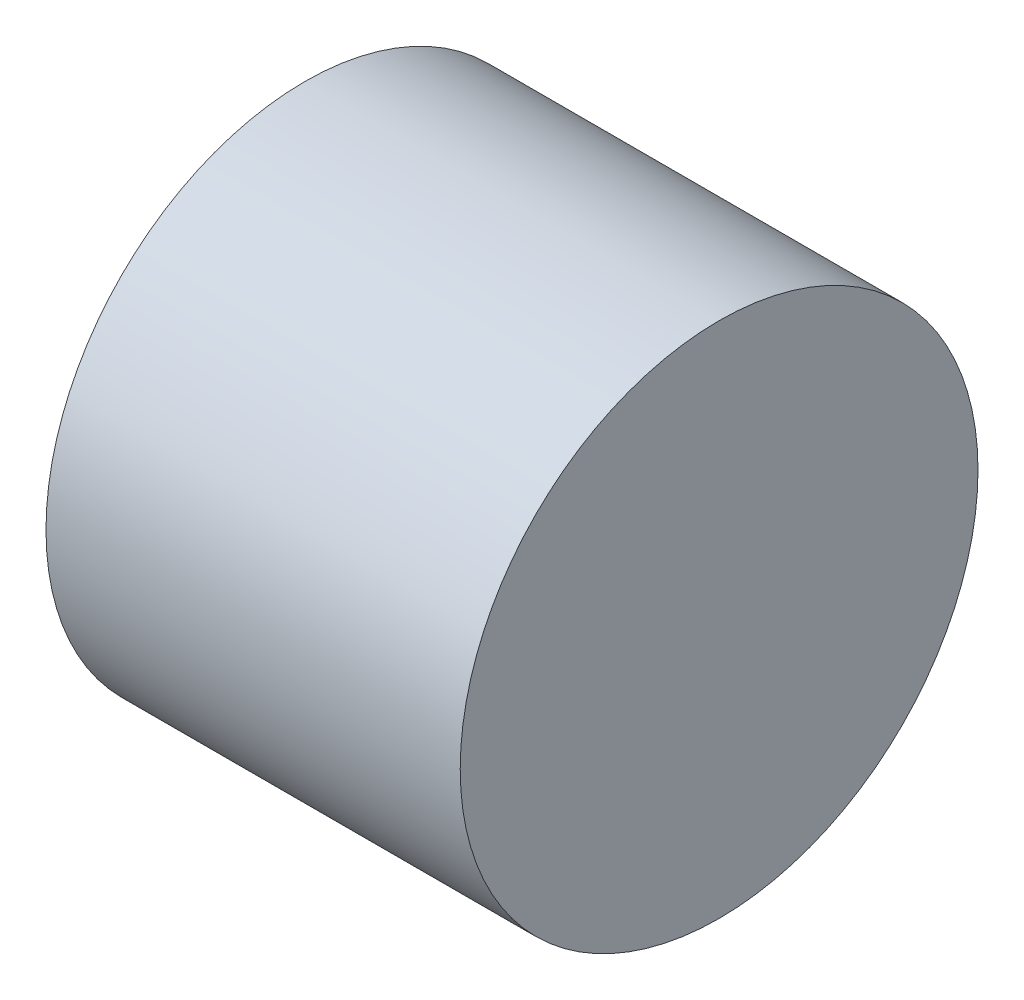
ISO-10303-21;
HEADER;
FILE_DESCRIPTION(('STEP AP214'),'2;1');
FILE_NAME('part.step','',(''),(''),'','','');
FILE_SCHEMA(('AUTOMOTIVE_DESIGN { 1 0 10303 214 1 1 1 1 }'));
ENDSEC;
DATA;
#1=APPLICATION_CONTEXT('core data for automotive mechanical design processes');
#2=APPLICATION_PROTOCOL_DEFINITION('international standard','automotive_design',2000,#1);
#3=PRODUCT_CONTEXT('',#1,'mechanical');
#4=PRODUCT('Part','Part','',(#3));
#5=PRODUCT_RELATED_PRODUCT_CATEGORY('part','',(#4));
#6=PRODUCT_DEFINITION_FORMATION('','',#4);
#7=PRODUCT_DEFINITION_CONTEXT('part definition',#1,'design');
#8=PRODUCT_DEFINITION('design','',#6,#7);
#9=PRODUCT_DEFINITION_SHAPE('','',#8);
#10=(LENGTH_UNIT() NAMED_UNIT(*) SI_UNIT(.MILLI.,.METRE.));
#11=(NAMED_UNIT(*) PLANE_ANGLE_UNIT() SI_UNIT($,.RADIAN.));
#12=(NAMED_UNIT(*) SI_UNIT($,.STERADIAN.) SOLID_ANGLE_UNIT());
#13=UNCERTAINTY_MEASURE_WITH_UNIT(LENGTH_MEASURE(1.E-05),#10,'distance_accuracy_value','');
#14=(GEOMETRIC_REPRESENTATION_CONTEXT(3) GLOBAL_UNCERTAINTY_ASSIGNED_CONTEXT((#13)) GLOBAL_UNIT_ASSIGNED_CONTEXT((#10,
#11,#12)) REPRESENTATION_CONTEXT('',''));
#15=CARTESIAN_POINT('',(0.,0.,0.));
#16=DIRECTION('',(0.,0.,1.));
#17=DIRECTION('',(1.,0.,0.));
#18=AXIS2_PLACEMENT_3D('',#15,#16,#17);
#19=CARTESIAN_POINT('',(160.,0.,0.));
#20=DIRECTION('',(-1.,0.,0.));
#21=DIRECTION('',(0.,0.,1.));
#22=AXIS2_PLACEMENT_3D('',#19,#20,#21);
#23=CYLINDRICAL_SURFACE('',#22,100.);
#24=CARTESIAN_POINT('',(160.,0.,0.));
#25=DIRECTION('',(1.,0.,0.));
#26=DIRECTION('',(0.,0.,-1.));
#27=AXIS2_PLACEMENT_3D('',#24,#25,#26);
#28=CIRCLE('',#27,100.);
#29=CARTESIAN_POINT('',(160.,0.,-100.));
#30=VERTEX_POINT('',#29);
#31=EDGE_CURVE('E10',#30,#30,#28,.T.);
#32=ORIENTED_EDGE('',*,*,#31,.F.);
#33=EDGE_LOOP('',(#32));
#34=FACE_BOUND('',#33,.T.);
#35=CARTESIAN_POINT('',(0.,0.,0.));
#36=DIRECTION('',(1.,0.,0.));
#37=DIRECTION('',(0.,0.,-1.));
#38=AXIS2_PLACEMENT_3D('',#35,#36,#37);
#39=CIRCLE('',#38,100.);
#40=CARTESIAN_POINT('',(0.,0.,-100.));
#41=VERTEX_POINT('',#40);
#42=EDGE_CURVE('E46',#41,#41,#39,.T.);
#43=ORIENTED_EDGE('',*,*,#42,.T.);
#44=EDGE_LOOP('',(#43));
#45=FACE_BOUND('',#44,.T.);
#46=ADVANCED_FACE('F43',(#34,#45),#23,.T.);
#47=CARTESIAN_POINT('',(160.,0.,0.));
#48=DIRECTION('',(1.,0.,0.));
#49=DIRECTION('',(0.,0.,-1.));
#50=AXIS2_PLACEMENT_3D('',#47,#48,#49);
#51=PLANE('',#50);
#52=ORIENTED_EDGE('',*,*,#31,.T.);
#53=EDGE_LOOP('',(#52));
#54=FACE_BOUND('',#53,.T.);
#55=ADVANCED_FACE('F60',(#54),#51,.T.);
#56=CARTESIAN_POINT('',(0.,0.,0.));
#57=DIRECTION('',(1.,0.,0.));
#58=DIRECTION('',(0.,0.,-1.));
#59=AXIS2_PLACEMENT_3D('',#56,#57,#58);
#60=PLANE('',#59);
#61=ORIENTED_EDGE('',*,*,#42,.F.);
#62=EDGE_LOOP('',(#61));
#63=FACE_BOUND('',#62,.T.);
#64=ADVANCED_FACE('F58',(#63),#60,.F.);
#65=CLOSED_SHELL('',(#46,#55,#64));
#66=MANIFOLD_SOLID_BREP('B2',#65);
#67=ADVANCED_BREP_SHAPE_REPRESENTATION('',(#18,#66),#14);
#68=SHAPE_DEFINITION_REPRESENTATION(#9,#67);
ENDSEC;
END-ISO-10303-21;
